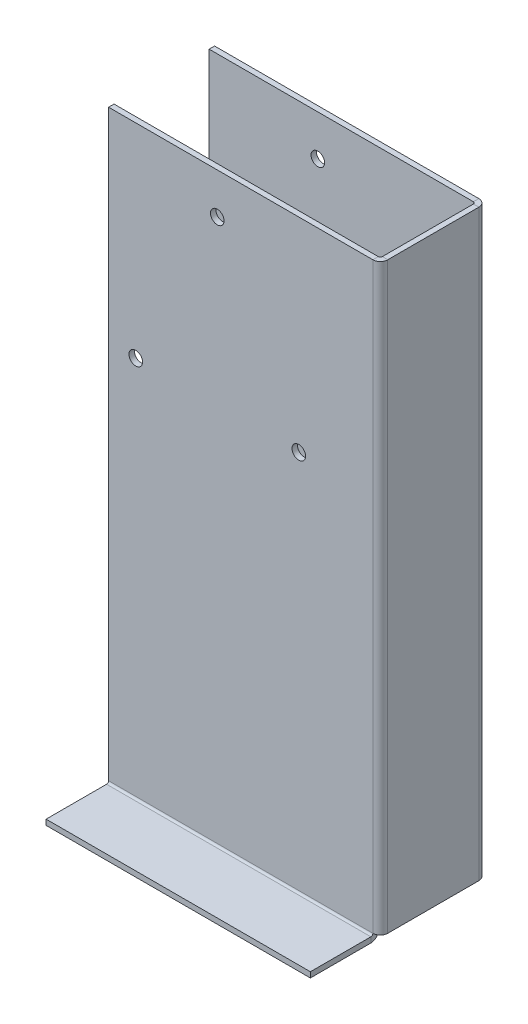
ISO-10303-21;
HEADER;
FILE_DESCRIPTION(('STEP AP214'),'2;1');
FILE_NAME('part.step','',(''),(''),'','','');
FILE_SCHEMA(('AUTOMOTIVE_DESIGN { 1 0 10303 214 1 1 1 1 }'));
ENDSEC;
DATA;
#1=APPLICATION_CONTEXT('core data for automotive mechanical design processes');
#2=APPLICATION_PROTOCOL_DEFINITION('international standard','automotive_design',2000,#1);
#3=PRODUCT_CONTEXT('',#1,'mechanical');
#4=PRODUCT('Part','Part','',(#3));
#5=PRODUCT_RELATED_PRODUCT_CATEGORY('part','',(#4));
#6=PRODUCT_DEFINITION_FORMATION('','',#4);
#7=PRODUCT_DEFINITION_CONTEXT('part definition',#1,'design');
#8=PRODUCT_DEFINITION('design','',#6,#7);
#9=PRODUCT_DEFINITION_SHAPE('','',#8);
#10=(LENGTH_UNIT() NAMED_UNIT(*) SI_UNIT(.MILLI.,.METRE.));
#11=(NAMED_UNIT(*) PLANE_ANGLE_UNIT() SI_UNIT($,.RADIAN.));
#12=(NAMED_UNIT(*) SI_UNIT($,.STERADIAN.) SOLID_ANGLE_UNIT());
#13=UNCERTAINTY_MEASURE_WITH_UNIT(LENGTH_MEASURE(1.E-05),#10,'distance_accuracy_value','');
#14=(GEOMETRIC_REPRESENTATION_CONTEXT(3) GLOBAL_UNCERTAINTY_ASSIGNED_CONTEXT((#13)) GLOBAL_UNIT_ASSIGNED_CONTEXT((#10,
#11,#12)) REPRESENTATION_CONTEXT('',''));
#15=CARTESIAN_POINT('',(0.,0.,0.));
#16=DIRECTION('',(0.,0.,1.));
#17=DIRECTION('',(1.,0.,0.));
#18=AXIS2_PLACEMENT_3D('',#15,#16,#17);
#19=CARTESIAN_POINT('',(1.52655665885959E-13,0.,-39.7366000000006));
#20=DIRECTION('',(-1.,0.,0.));
#21=DIRECTION('',(0.,-1.,0.));
#22=AXIS2_PLACEMENT_3D('',#19,#20,#21);
#23=CYLINDRICAL_SURFACE('',#22,2.73660000000001);
#24=DIRECTION('',(-1.,0.,0.));
#25=VECTOR('',#24,1.);
#26=CARTESIAN_POINT('',(97.2634000000002,-2.7366,-39.7366));
#27=LINE('',#26,#25);
#28=CARTESIAN_POINT('',(27.0000000000001,-2.73660000000008,-39.7366000000002));
#29=VERTEX_POINT('',#28);
#30=CARTESIAN_POINT('',(68.2634000000001,-2.73660000000008,-39.7366));
#31=VERTEX_POINT('',#30);
#32=EDGE_CURVE('E470',#29,#31,#27,.F.);
#33=ORIENTED_EDGE('',*,*,#32,.T.);
#34=CARTESIAN_POINT('',(68.2634000000001,0.,-39.7366000000003));
#35=DIRECTION('',(-1.,0.,0.));
#36=DIRECTION('',(0.,0.,1.));
#37=AXIS2_PLACEMENT_3D('',#34,#35,#36);
#38=CIRCLE('',#37,2.73660000000001);
#39=CARTESIAN_POINT('',(68.2634000000001,0.,-37.0000000000003));
#40=VERTEX_POINT('',#39);
#41=EDGE_CURVE('E424',#31,#40,#38,.T.);
#42=ORIENTED_EDGE('',*,*,#41,.T.);
#43=DIRECTION('',(1.,0.,0.));
#44=VECTOR('',#43,1.);
#45=CARTESIAN_POINT('',(1.18146875219874E-13,0.,-37.0000000000007));
#46=LINE('',#45,#44);
#47=CARTESIAN_POINT('',(27.0000000000001,0.,-37.0000000000006));
#48=VERTEX_POINT('',#47);
#49=EDGE_CURVE('E310',#40,#48,#46,.F.);
#50=ORIENTED_EDGE('',*,*,#49,.T.);
#51=CARTESIAN_POINT('',(27.0000000000001,0.,-39.7366000000005));
#52=DIRECTION('',(-1.,0.,0.));
#53=DIRECTION('',(0.,0.,1.));
#54=AXIS2_PLACEMENT_3D('',#51,#52,#53);
#55=CIRCLE('',#54,2.73660000000001);
#56=EDGE_CURVE('E438',#48,#29,#55,.F.);
#57=ORIENTED_EDGE('',*,*,#56,.T.);
#58=EDGE_LOOP('',(#33,#42,#50,#57));
#59=FACE_BOUND('',#58,.T.);
#60=ADVANCED_FACE('F119',(#59),#23,.T.);
#61=CARTESIAN_POINT('',(1.52655665885959E-13,0.,-39.7366000000006));
#62=DIRECTION('',(-1.,0.,0.));
#63=DIRECTION('',(0.,-1.,0.));
#64=AXIS2_PLACEMENT_3D('',#61,#62,#63);
#65=CYLINDRICAL_SURFACE('',#64,0.736600000000005);
#66=CARTESIAN_POINT('',(68.2634000000001,0.,-39.7366000000003));
#67=DIRECTION('',(1.,0.,0.));
#68=DIRECTION('',(0.,0.,-1.));
#69=AXIS2_PLACEMENT_3D('',#66,#67,#68);
#70=CIRCLE('',#69,0.736600000000005);
#71=CARTESIAN_POINT('',(68.2634000000001,-0.7366,-39.7366));
#72=VERTEX_POINT('',#71);
#73=CARTESIAN_POINT('',(68.2634000000001,0.,-39.0000000000003));
#74=VERTEX_POINT('',#73);
#75=EDGE_CURVE('E423',#72,#74,#70,.F.);
#76=ORIENTED_EDGE('',*,*,#75,.F.);
#77=DIRECTION('',(-1.,0.,0.));
#78=VECTOR('',#77,1.);
#79=CARTESIAN_POINT('',(97.2634000000002,-0.7366,-39.7366));
#80=LINE('',#79,#78);
#81=CARTESIAN_POINT('',(27.0000000000001,-0.736599999999999,-39.7366000000002));
#82=VERTEX_POINT('',#81);
#83=EDGE_CURVE('E461',#72,#82,#80,.T.);
#84=ORIENTED_EDGE('',*,*,#83,.T.);
#85=CARTESIAN_POINT('',(27.0000000000001,0.,-39.7366000000005));
#86=DIRECTION('',(-1.,0.,0.));
#87=DIRECTION('',(0.,0.,1.));
#88=AXIS2_PLACEMENT_3D('',#85,#86,#87);
#89=CIRCLE('',#88,0.736600000000005);
#90=CARTESIAN_POINT('',(27.0000000000001,0.,-39.0000000000004));
#91=VERTEX_POINT('',#90);
#92=EDGE_CURVE('E441',#91,#82,#89,.F.);
#93=ORIENTED_EDGE('',*,*,#92,.F.);
#94=DIRECTION('',(-1.,0.,0.));
#95=VECTOR('',#94,1.);
#96=CARTESIAN_POINT('',(2.74838428376477E-13,0.,-39.0000000000007));
#97=LINE('',#96,#95);
#98=EDGE_CURVE('E521',#74,#91,#97,.T.);
#99=ORIENTED_EDGE('',*,*,#98,.F.);
#100=EDGE_LOOP('',(#76,#84,#93,#99));
#101=FACE_BOUND('',#100,.T.);
#102=ADVANCED_FACE('F538',(#101),#65,.F.);
#103=CARTESIAN_POINT('',(0.,-2.73659999999986,0.));
#104=DIRECTION('',(0.,1.,0.));
#105=DIRECTION('',(0.,0.,1.));
#106=AXIS2_PLACEMENT_3D('',#103,#104,#105);
#107=PLANE('',#106);
#108=DIRECTION('',(0.,0.,-1.));
#109=VECTOR('',#108,1.);
#110=CARTESIAN_POINT('',(68.2634000000001,-2.73660000000008,-7.87116583932693));
#111=LINE('',#110,#109);
#112=CARTESIAN_POINT('',(68.2634000000001,-2.73660000000008,-62.0000000000002));
#113=VERTEX_POINT('',#112);
#114=EDGE_CURVE('E430',#31,#113,#111,.T.);
#115=ORIENTED_EDGE('',*,*,#114,.F.);
#116=ORIENTED_EDGE('',*,*,#32,.F.);
#117=DIRECTION('',(0.,0.,-1.));
#118=VECTOR('',#117,1.);
#119=CARTESIAN_POINT('',(27.0000000000001,-2.73660000000008,-7.87116583932693));
#120=LINE('',#119,#118);
#121=CARTESIAN_POINT('',(27.0000000000001,-2.73660000000008,-62.0000000000005));
#122=VERTEX_POINT('',#121);
#123=EDGE_CURVE('E454',#29,#122,#120,.T.);
#124=ORIENTED_EDGE('',*,*,#123,.T.);
#125=DIRECTION('',(1.,0.,0.));
#126=VECTOR('',#125,1.);
#127=CARTESIAN_POINT('',(4.24569898094263E-13,-2.73660000000008,-62.0000000000007));
#128=LINE('',#127,#126);
#129=EDGE_CURVE('E463',#122,#113,#128,.T.);
#130=ORIENTED_EDGE('',*,*,#129,.T.);
#131=EDGE_LOOP('',(#115,#116,#124,#130));
#132=FACE_BOUND('',#131,.T.);
#133=ADVANCED_FACE('F552',(#132),#107,.F.);
#134=CARTESIAN_POINT('',(0.,-0.736599999999859,0.));
#135=DIRECTION('',(0.,1.,0.));
#136=DIRECTION('',(0.,0.,1.));
#137=AXIS2_PLACEMENT_3D('',#134,#135,#136);
#138=PLANE('',#137);
#139=ORIENTED_EDGE('',*,*,#83,.F.);
#140=DIRECTION('',(0.,0.,1.));
#141=VECTOR('',#140,1.);
#142=CARTESIAN_POINT('',(68.2634000000001,-0.736599999999861,0.));
#143=LINE('',#142,#141);
#144=CARTESIAN_POINT('',(68.2634000000001,-0.736600000000077,-62.0000000000002));
#145=VERTEX_POINT('',#144);
#146=EDGE_CURVE('E431',#72,#145,#143,.F.);
#147=ORIENTED_EDGE('',*,*,#146,.T.);
#148=DIRECTION('',(-1.,0.,0.));
#149=VECTOR('',#148,1.);
#150=CARTESIAN_POINT('',(97.2634000000003,-0.736600000000078,-62.));
#151=LINE('',#150,#149);
#152=CARTESIAN_POINT('',(27.0000000000001,-0.736600000000076,-62.0000000000005));
#153=VERTEX_POINT('',#152);
#154=EDGE_CURVE('E467',#153,#145,#151,.F.);
#155=ORIENTED_EDGE('',*,*,#154,.F.);
#156=DIRECTION('',(0.,0.,1.));
#157=VECTOR('',#156,1.);
#158=CARTESIAN_POINT('',(27.0000000000001,-0.73659999999986,0.));
#159=LINE('',#158,#157);
#160=EDGE_CURVE('E136',#82,#153,#159,.F.);
#161=ORIENTED_EDGE('',*,*,#160,.F.);
#162=EDGE_LOOP('',(#139,#147,#155,#161));
#163=FACE_BOUND('',#162,.T.);
#164=ADVANCED_FACE('F541',(#163),#138,.T.);
#165=CARTESIAN_POINT('',(97.2634000000003,-2.73660000000008,-62.));
#166=DIRECTION('',(0.,0.,1.));
#167=DIRECTION('',(1.,0.,0.));
#168=AXIS2_PLACEMENT_3D('',#165,#166,#167);
#169=PLANE('',#168);
#170=DIRECTION('',(0.,-1.,0.));
#171=VECTOR('',#170,1.);
#172=CARTESIAN_POINT('',(68.2634000000001,-2.73660000000008,-62.0000000000002));
#173=LINE('',#172,#171);
#174=EDGE_CURVE('E436',#113,#145,#173,.F.);
#175=ORIENTED_EDGE('',*,*,#174,.F.);
#176=ORIENTED_EDGE('',*,*,#129,.F.);
#177=DIRECTION('',(0.,-1.,0.));
#178=VECTOR('',#177,1.);
#179=CARTESIAN_POINT('',(27.0000000000001,-2.73660000000008,-62.0000000000005));
#180=LINE('',#179,#178);
#181=EDGE_CURVE('E456',#122,#153,#180,.F.);
#182=ORIENTED_EDGE('',*,*,#181,.T.);
#183=ORIENTED_EDGE('',*,*,#154,.T.);
#184=EDGE_LOOP('',(#175,#176,#182,#183));
#185=FACE_BOUND('',#184,.T.);
#186=ADVANCED_FACE('F545',(#185),#169,.F.);
#187=CARTESIAN_POINT('',(100.,0.,-1.99999999999999));
#188=DIRECTION('',(0.,-1.,0.));
#189=DIRECTION('',(0.,0.,-1.));
#190=AXIS2_PLACEMENT_3D('',#187,#188,#189);
#191=PLANE('',#190);
#192=DIRECTION('',(0.,0.,-1.));
#193=VECTOR('',#192,1.);
#194=CARTESIAN_POINT('',(98.,0.,3.37567811541433E-13));
#195=LINE('',#194,#193);
#196=CARTESIAN_POINT('',(98.0000000000001,0.,-36.2634));
#197=VERTEX_POINT('',#196);
#198=CARTESIAN_POINT('',(98.,0.,-2.73660000000001));
#199=VERTEX_POINT('',#198);
#200=EDGE_CURVE('E341',#197,#199,#195,.F.);
#201=ORIENTED_EDGE('',*,*,#200,.F.);
#202=DIRECTION('',(1.,0.,0.));
#203=VECTOR('',#202,1.);
#204=CARTESIAN_POINT('',(98.0000000000001,0.,-36.2634));
#205=LINE('',#204,#203);
#206=CARTESIAN_POINT('',(100.,0.,-36.2634));
#207=VERTEX_POINT('',#206);
#208=EDGE_CURVE('E303',#197,#207,#205,.T.);
#209=ORIENTED_EDGE('',*,*,#208,.T.);
#210=DIRECTION('',(0.,0.,1.));
#211=VECTOR('',#210,1.);
#212=CARTESIAN_POINT('',(100.,0.,-1.99999999999999));
#213=LINE('',#212,#211);
#214=CARTESIAN_POINT('',(100.,0.,-2.7366));
#215=VERTEX_POINT('',#214);
#216=EDGE_CURVE('E335',#207,#215,#213,.T.);
#217=ORIENTED_EDGE('',*,*,#216,.T.);
#218=DIRECTION('',(1.,0.,0.));
#219=VECTOR('',#218,1.);
#220=CARTESIAN_POINT('',(98.,0.,-2.73660000000001));
#221=LINE('',#220,#219);
#222=EDGE_CURVE('E349',#199,#215,#221,.T.);
#223=ORIENTED_EDGE('',*,*,#222,.F.);
#224=EDGE_LOOP('',(#201,#209,#217,#223));
#225=FACE_BOUND('',#224,.T.);
#226=ADVANCED_FACE('F644',(#225),#191,.T.);
#227=CARTESIAN_POINT('',(100.,0.,3.44550774219119E-13));
#228=DIRECTION('',(1.,0.,0.));
#229=DIRECTION('',(0.,0.,-1.));
#230=AXIS2_PLACEMENT_3D('',#227,#228,#229);
#231=PLANE('',#230);
#232=ORIENTED_EDGE('',*,*,#216,.F.);
#233=DIRECTION('',(0.,-1.,0.));
#234=VECTOR('',#233,1.);
#235=CARTESIAN_POINT('',(100.,0.,-36.2634));
#236=LINE('',#235,#234);
#237=CARTESIAN_POINT('',(100.,214.69,-36.2634));
#238=VERTEX_POINT('',#237);
#239=EDGE_CURVE('E323',#207,#238,#236,.F.);
#240=ORIENTED_EDGE('',*,*,#239,.T.);
#241=DIRECTION('',(0.,0.,-1.));
#242=VECTOR('',#241,1.);
#243=CARTESIAN_POINT('',(100.,214.69,-39.));
#244=LINE('',#243,#242);
#245=CARTESIAN_POINT('',(100.,214.69,-2.7366));
#246=VERTEX_POINT('',#245);
#247=EDGE_CURVE('E338',#246,#238,#244,.T.);
#248=ORIENTED_EDGE('',*,*,#247,.F.);
#249=DIRECTION('',(0.,-1.,0.));
#250=VECTOR('',#249,1.);
#251=CARTESIAN_POINT('',(100.,0.,-2.7366));
#252=LINE('',#251,#250);
#253=EDGE_CURVE('E346',#246,#215,#252,.T.);
#254=ORIENTED_EDGE('',*,*,#253,.T.);
#255=EDGE_LOOP('',(#232,#240,#248,#254));
#256=FACE_BOUND('',#255,.T.);
#257=ADVANCED_FACE('F640',(#256),#231,.T.);
#258=CARTESIAN_POINT('',(98.,0.,3.37567811541433E-13));
#259=DIRECTION('',(1.,0.,0.));
#260=DIRECTION('',(0.,0.,-1.));
#261=AXIS2_PLACEMENT_3D('',#258,#259,#260);
#262=PLANE('',#261);
#263=DIRECTION('',(0.,-1.,0.));
#264=VECTOR('',#263,1.);
#265=CARTESIAN_POINT('',(98.0000000000001,0.,-36.2634));
#266=LINE('',#265,#264);
#267=CARTESIAN_POINT('',(98.0000000000001,214.69,-36.2634));
#268=VERTEX_POINT('',#267);
#269=EDGE_CURVE('E304',#197,#268,#266,.F.);
#270=ORIENTED_EDGE('',*,*,#269,.F.);
#271=ORIENTED_EDGE('',*,*,#200,.T.);
#272=DIRECTION('',(0.,1.,0.));
#273=VECTOR('',#272,1.);
#274=CARTESIAN_POINT('',(98.,214.69,-2.73660000000001));
#275=LINE('',#274,#273);
#276=CARTESIAN_POINT('',(98.,214.69,-2.73660000000001));
#277=VERTEX_POINT('',#276);
#278=EDGE_CURVE('E352',#277,#199,#275,.F.);
#279=ORIENTED_EDGE('',*,*,#278,.F.);
#280=DIRECTION('',(0.,0.,1.));
#281=VECTOR('',#280,1.);
#282=CARTESIAN_POINT('',(98.,214.69,3.37567811541433E-13));
#283=LINE('',#282,#281);
#284=EDGE_CURVE('E343',#277,#268,#283,.F.);
#285=ORIENTED_EDGE('',*,*,#284,.T.);
#286=EDGE_LOOP('',(#270,#271,#279,#285));
#287=FACE_BOUND('',#286,.T.);
#288=ADVANCED_FACE('F643',(#287),#262,.F.);
#289=CARTESIAN_POINT('',(0.,0.,-2.));
#290=DIRECTION('',(0.,0.,-1.));
#291=DIRECTION('',(-1.,0.,0.));
#292=AXIS2_PLACEMENT_3D('',#289,#290,#291);
#293=PLANE('',#292);
#294=CARTESIAN_POINT('',(70.,139.69,-2.));
#295=DIRECTION('',(0.,0.,-1.));
#296=DIRECTION('',(-1.,0.,0.));
#297=AXIS2_PLACEMENT_3D('',#294,#295,#296);
#298=CIRCLE('',#297,2.50000000000001);
#299=CARTESIAN_POINT('',(67.5,139.69,-2.));
#300=VERTEX_POINT('',#299);
#301=EDGE_CURVE('E413',#300,#300,#298,.T.);
#302=ORIENTED_EDGE('',*,*,#301,.F.);
#303=EDGE_LOOP('',(#302));
#304=FACE_BOUND('',#303,.T.);
#305=CARTESIAN_POINT('',(10.,139.69,-2.));
#306=DIRECTION('',(0.,0.,-1.));
#307=DIRECTION('',(-1.,0.,0.));
#308=AXIS2_PLACEMENT_3D('',#305,#306,#307);
#309=CIRCLE('',#308,2.50000000000003);
#310=CARTESIAN_POINT('',(7.49999999999997,139.69,-2.));
#311=VERTEX_POINT('',#310);
#312=EDGE_CURVE('E400',#311,#311,#309,.T.);
#313=ORIENTED_EDGE('',*,*,#312,.F.);
#314=EDGE_LOOP('',(#313));
#315=FACE_BOUND('',#314,.T.);
#316=CARTESIAN_POINT('',(40.,199.69,-2.));
#317=DIRECTION('',(0.,0.,-1.));
#318=DIRECTION('',(-1.,0.,0.));
#319=AXIS2_PLACEMENT_3D('',#316,#317,#318);
#320=CIRCLE('',#319,2.50000000000004);
#321=CARTESIAN_POINT('',(37.5,199.69,-2.));
#322=VERTEX_POINT('',#321);
#323=EDGE_CURVE('E396',#322,#322,#320,.T.);
#324=ORIENTED_EDGE('',*,*,#323,.F.);
#325=EDGE_LOOP('',(#324));
#326=FACE_BOUND('',#325,.T.);
#327=DIRECTION('',(-1.,0.,0.));
#328=VECTOR('',#327,1.);
#329=CARTESIAN_POINT('',(0.,214.69,-2.));
#330=LINE('',#329,#328);
#331=CARTESIAN_POINT('',(97.2634,214.69,-2.));
#332=VERTEX_POINT('',#331);
#333=CARTESIAN_POINT('',(0.,214.69,-2.));
#334=VERTEX_POINT('',#333);
#335=EDGE_CURVE('E386',#332,#334,#330,.T.);
#336=ORIENTED_EDGE('',*,*,#335,.F.);
#337=DIRECTION('',(0.,-1.,0.));
#338=VECTOR('',#337,1.);
#339=CARTESIAN_POINT('',(97.2634,0.,-2.));
#340=LINE('',#339,#338);
#341=CARTESIAN_POINT('',(97.2634,0.,-2.));
#342=VERTEX_POINT('',#341);
#343=EDGE_CURVE('E369',#342,#332,#340,.F.);
#344=ORIENTED_EDGE('',*,*,#343,.F.);
#345=DIRECTION('',(1.,0.,0.));
#346=VECTOR('',#345,1.);
#347=CARTESIAN_POINT('',(0.,0.,-2.));
#348=LINE('',#347,#346);
#349=CARTESIAN_POINT('',(0.,0.,-2.));
#350=VERTEX_POINT('',#349);
#351=EDGE_CURVE('E382',#350,#342,#348,.T.);
#352=ORIENTED_EDGE('',*,*,#351,.F.);
#353=DIRECTION('',(0.,-1.,0.));
#354=VECTOR('',#353,1.);
#355=CARTESIAN_POINT('',(0.,0.,-2.));
#356=LINE('',#355,#354);
#357=EDGE_CURVE('E379',#334,#350,#356,.T.);
#358=ORIENTED_EDGE('',*,*,#357,.F.);
#359=EDGE_LOOP('',(#336,#344,#352,#358));
#360=FACE_BOUND('',#359,.T.);
#361=ADVANCED_FACE('F648',(#304,#315,#326,#360),#293,.T.);
#362=CARTESIAN_POINT('',(0.,0.,0.));
#363=DIRECTION('',(0.,0.,-1.));
#364=DIRECTION('',(-1.,0.,0.));
#365=AXIS2_PLACEMENT_3D('',#362,#363,#364);
#366=PLANE('',#365);
#367=CARTESIAN_POINT('',(70.,139.69,0.));
#368=DIRECTION('',(0.,0.,1.));
#369=DIRECTION('',(1.,0.,0.));
#370=AXIS2_PLACEMENT_3D('',#367,#368,#369);
#371=CIRCLE('',#370,2.50000000000001);
#372=CARTESIAN_POINT('',(72.5,139.69,0.));
#373=VERTEX_POINT('',#372);
#374=EDGE_CURVE('E1119',#373,#373,#371,.T.);
#375=ORIENTED_EDGE('',*,*,#374,.F.);
#376=EDGE_LOOP('',(#375));
#377=FACE_BOUND('',#376,.T.);
#378=CARTESIAN_POINT('',(10.,139.69,0.));
#379=DIRECTION('',(0.,0.,1.));
#380=DIRECTION('',(1.,0.,0.));
#381=AXIS2_PLACEMENT_3D('',#378,#379,#380);
#382=CIRCLE('',#381,2.50000000000003);
#383=CARTESIAN_POINT('',(12.5,139.69,0.));
#384=VERTEX_POINT('',#383);
#385=EDGE_CURVE('E408',#384,#384,#382,.T.);
#386=ORIENTED_EDGE('',*,*,#385,.F.);
#387=EDGE_LOOP('',(#386));
#388=FACE_BOUND('',#387,.T.);
#389=CARTESIAN_POINT('',(40.,199.69,0.));
#390=DIRECTION('',(0.,0.,1.));
#391=DIRECTION('',(1.,0.,0.));
#392=AXIS2_PLACEMENT_3D('',#389,#390,#391);
#393=CIRCLE('',#392,2.50000000000004);
#394=CARTESIAN_POINT('',(42.5,199.69,0.));
#395=VERTEX_POINT('',#394);
#396=EDGE_CURVE('E405',#395,#395,#393,.T.);
#397=ORIENTED_EDGE('',*,*,#396,.F.);
#398=EDGE_LOOP('',(#397));
#399=FACE_BOUND('',#398,.T.);
#400=DIRECTION('',(0.,-1.,0.));
#401=VECTOR('',#400,1.);
#402=CARTESIAN_POINT('',(97.2634,0.,0.));
#403=LINE('',#402,#401);
#404=CARTESIAN_POINT('',(97.2634,0.,0.));
#405=VERTEX_POINT('',#404);
#406=CARTESIAN_POINT('',(97.2634,214.69,0.));
#407=VERTEX_POINT('',#406);
#408=EDGE_CURVE('E357',#405,#407,#403,.F.);
#409=ORIENTED_EDGE('',*,*,#408,.T.);
#410=DIRECTION('',(-1.,0.,0.));
#411=VECTOR('',#410,1.);
#412=CARTESIAN_POINT('',(0.,214.69,0.));
#413=LINE('',#412,#411);
#414=CARTESIAN_POINT('',(0.,214.69,0.));
#415=VERTEX_POINT('',#414);
#416=EDGE_CURVE('E383',#407,#415,#413,.T.);
#417=ORIENTED_EDGE('',*,*,#416,.T.);
#418=DIRECTION('',(0.,-1.,0.));
#419=VECTOR('',#418,1.);
#420=CARTESIAN_POINT('',(0.,0.,0.));
#421=LINE('',#420,#419);
#422=CARTESIAN_POINT('',(0.,0.,0.));
#423=VERTEX_POINT('',#422);
#424=EDGE_CURVE('E376',#415,#423,#421,.T.);
#425=ORIENTED_EDGE('',*,*,#424,.T.);
#426=DIRECTION('',(1.,0.,0.));
#427=VECTOR('',#426,1.);
#428=CARTESIAN_POINT('',(0.,0.,0.));
#429=LINE('',#428,#427);
#430=EDGE_CURVE('E390',#423,#405,#429,.T.);
#431=ORIENTED_EDGE('',*,*,#430,.T.);
#432=EDGE_LOOP('',(#409,#417,#425,#431));
#433=FACE_BOUND('',#432,.T.);
#434=ADVANCED_FACE('F675',(#377,#388,#399,#433),#366,.F.);
#435=CARTESIAN_POINT('',(0.,0.,-2.));
#436=DIRECTION('',(-1.,0.,0.));
#437=DIRECTION('',(0.,0.,1.));
#438=AXIS2_PLACEMENT_3D('',#435,#436,#437);
#439=PLANE('',#438);
#440=ORIENTED_EDGE('',*,*,#424,.F.);
#441=DIRECTION('',(0.,0.,1.));
#442=VECTOR('',#441,1.);
#443=CARTESIAN_POINT('',(0.,214.69,-2.));
#444=LINE('',#443,#442);
#445=EDGE_CURVE('E13',#334,#415,#444,.T.);
#446=ORIENTED_EDGE('',*,*,#445,.F.);
#447=ORIENTED_EDGE('',*,*,#357,.T.);
#448=DIRECTION('',(0.,0.,1.));
#449=VECTOR('',#448,1.);
#450=CARTESIAN_POINT('',(0.,0.,-2.));
#451=LINE('',#450,#449);
#452=EDGE_CURVE('E128',#350,#423,#451,.T.);
#453=ORIENTED_EDGE('',*,*,#452,.T.);
#454=EDGE_LOOP('',(#440,#446,#447,#453));
#455=FACE_BOUND('',#454,.T.);
#456=ADVANCED_FACE('F121',(#455),#439,.T.);
#457=CARTESIAN_POINT('',(0.,214.69,-2.));
#458=DIRECTION('',(0.,1.,0.));
#459=DIRECTION('',(0.,0.,1.));
#460=AXIS2_PLACEMENT_3D('',#457,#458,#459);
#461=PLANE('',#460);
#462=DIRECTION('',(0.,0.,1.));
#463=VECTOR('',#462,1.);
#464=CARTESIAN_POINT('',(97.2634,214.69,-2.));
#465=LINE('',#464,#463);
#466=EDGE_CURVE('E373',#332,#407,#465,.T.);
#467=ORIENTED_EDGE('',*,*,#466,.F.);
#468=ORIENTED_EDGE('',*,*,#335,.T.);
#469=ORIENTED_EDGE('',*,*,#445,.T.);
#470=ORIENTED_EDGE('',*,*,#416,.F.);
#471=EDGE_LOOP('',(#467,#468,#469,#470));
#472=FACE_BOUND('',#471,.T.);
#473=ADVANCED_FACE('F668',(#472),#461,.T.);
#474=CARTESIAN_POINT('',(97.2634,214.69,-2.73660000000001));
#475=DIRECTION('',(0.,1.,0.));
#476=DIRECTION('',(0.,0.,1.));
#477=AXIS2_PLACEMENT_3D('',#474,#475,#476);
#478=PLANE('',#477);
#479=DIRECTION('',(1.,0.,0.));
#480=VECTOR('',#479,1.);
#481=CARTESIAN_POINT('',(100.,214.69,-2.7366));
#482=LINE('',#481,#480);
#483=EDGE_CURVE('E333',#277,#246,#482,.T.);
#484=ORIENTED_EDGE('',*,*,#483,.F.);
#485=CARTESIAN_POINT('',(97.2634,214.69,-2.73660000000001));
#486=DIRECTION('',(0.,-1.,0.));
#487=DIRECTION('',(0.,0.,-1.));
#488=AXIS2_PLACEMENT_3D('',#485,#486,#487);
#489=CIRCLE('',#488,0.736600000000004);
#490=EDGE_CURVE('E366',#332,#277,#489,.F.);
#491=ORIENTED_EDGE('',*,*,#490,.F.);
#492=ORIENTED_EDGE('',*,*,#466,.T.);
#493=CARTESIAN_POINT('',(97.2634,214.69,-2.73660000000001));
#494=DIRECTION('',(0.,-1.,0.));
#495=DIRECTION('',(0.,0.,-1.));
#496=AXIS2_PLACEMENT_3D('',#493,#494,#495);
#497=CIRCLE('',#496,2.7366);
#498=EDGE_CURVE('E359',#407,#246,#497,.F.);
#499=ORIENTED_EDGE('',*,*,#498,.T.);
#500=EDGE_LOOP('',(#484,#491,#492,#499));
#501=FACE_BOUND('',#500,.T.);
#502=ADVANCED_FACE('F665',(#501),#478,.T.);
#503=CARTESIAN_POINT('',(97.2634,0.,-2.73660000000001));
#504=DIRECTION('',(0.,1.,0.));
#505=DIRECTION('',(0.,0.,1.));
#506=AXIS2_PLACEMENT_3D('',#503,#504,#505);
#507=PLANE('',#506);
#508=CARTESIAN_POINT('',(97.2634,0.,-2.73660000000001));
#509=DIRECTION('',(0.,-1.,0.));
#510=DIRECTION('',(0.,0.,-1.));
#511=AXIS2_PLACEMENT_3D('',#508,#509,#510);
#512=CIRCLE('',#511,0.736600000000004);
#513=EDGE_CURVE('E337',#199,#342,#512,.T.);
#514=ORIENTED_EDGE('',*,*,#513,.F.);
#515=ORIENTED_EDGE('',*,*,#222,.T.);
#516=CARTESIAN_POINT('',(97.2634,0.,-2.73660000000001));
#517=DIRECTION('',(0.,-1.,0.));
#518=DIRECTION('',(0.,0.,-1.));
#519=AXIS2_PLACEMENT_3D('',#516,#517,#518);
#520=CIRCLE('',#519,2.7366);
#521=EDGE_CURVE('E360',#215,#405,#520,.T.);
#522=ORIENTED_EDGE('',*,*,#521,.T.);
#523=DIRECTION('',(0.,0.,1.));
#524=VECTOR('',#523,1.);
#525=CARTESIAN_POINT('',(97.2634,0.,-2.));
#526=LINE('',#525,#524);
#527=EDGE_CURVE('E363',#342,#405,#526,.T.);
#528=ORIENTED_EDGE('',*,*,#527,.F.);
#529=EDGE_LOOP('',(#514,#515,#522,#528));
#530=FACE_BOUND('',#529,.T.);
#531=ADVANCED_FACE('F660',(#530),#507,.F.);
#532=CARTESIAN_POINT('',(97.2634,0.,-2.73660000000001));
#533=DIRECTION('',(0.,-1.,0.));
#534=DIRECTION('',(1.,0.,0.));
#535=AXIS2_PLACEMENT_3D('',#532,#533,#534);
#536=CYLINDRICAL_SURFACE('',#535,2.7366);
#537=ORIENTED_EDGE('',*,*,#408,.F.);
#538=ORIENTED_EDGE('',*,*,#521,.F.);
#539=ORIENTED_EDGE('',*,*,#253,.F.);
#540=ORIENTED_EDGE('',*,*,#498,.F.);
#541=EDGE_LOOP('',(#537,#538,#539,#540));
#542=FACE_BOUND('',#541,.T.);
#543=ADVANCED_FACE('F657',(#542),#536,.T.);
#544=CARTESIAN_POINT('',(97.2634,0.,-2.73660000000001));
#545=DIRECTION('',(0.,-1.,0.));
#546=DIRECTION('',(1.,0.,0.));
#547=AXIS2_PLACEMENT_3D('',#544,#545,#546);
#548=CYLINDRICAL_SURFACE('',#547,0.736600000000004);
#549=ORIENTED_EDGE('',*,*,#343,.T.);
#550=ORIENTED_EDGE('',*,*,#490,.T.);
#551=ORIENTED_EDGE('',*,*,#278,.T.);
#552=ORIENTED_EDGE('',*,*,#513,.T.);
#553=EDGE_LOOP('',(#549,#550,#551,#552));
#554=FACE_BOUND('',#553,.T.);
#555=ADVANCED_FACE('F655',(#554),#548,.F.);
#556=CARTESIAN_POINT('',(100.,214.69,-39.));
#557=DIRECTION('',(0.,1.,0.));
#558=DIRECTION('',(0.,0.,1.));
#559=AXIS2_PLACEMENT_3D('',#556,#557,#558);
#560=PLANE('',#559);
#561=DIRECTION('',(1.,0.,0.));
#562=VECTOR('',#561,1.);
#563=CARTESIAN_POINT('',(98.0000000000001,214.69,-36.2634));
#564=LINE('',#563,#562);
#565=EDGE_CURVE('E331',#268,#238,#564,.T.);
#566=ORIENTED_EDGE('',*,*,#565,.F.);
#567=ORIENTED_EDGE('',*,*,#284,.F.);
#568=ORIENTED_EDGE('',*,*,#483,.T.);
#569=ORIENTED_EDGE('',*,*,#247,.T.);
#570=EDGE_LOOP('',(#566,#567,#568,#569));
#571=FACE_BOUND('',#570,.T.);
#572=ADVANCED_FACE('F636',(#571),#560,.T.);
#573=CARTESIAN_POINT('',(97.2634000000001,214.69,-36.2634));
#574=DIRECTION('',(0.,1.,0.));
#575=DIRECTION('',(0.,0.,1.));
#576=AXIS2_PLACEMENT_3D('',#573,#574,#575);
#577=PLANE('',#576);
#578=DIRECTION('',(0.,0.,1.));
#579=VECTOR('',#578,1.);
#580=CARTESIAN_POINT('',(97.2634000000001,214.69,-39.));
#581=LINE('',#580,#579);
#582=CARTESIAN_POINT('',(97.2634000000001,214.69,-37.));
#583=VERTEX_POINT('',#582);
#584=CARTESIAN_POINT('',(97.2634000000001,214.69,-39.));
#585=VERTEX_POINT('',#584);
#586=EDGE_CURVE('E299',#583,#585,#581,.F.);
#587=ORIENTED_EDGE('',*,*,#586,.F.);
#588=CARTESIAN_POINT('',(97.2634000000001,214.69,-36.2634));
#589=DIRECTION('',(0.,-1.,0.));
#590=DIRECTION('',(0.,0.,-1.));
#591=AXIS2_PLACEMENT_3D('',#588,#589,#590);
#592=CIRCLE('',#591,0.736599999999997);
#593=EDGE_CURVE('E295',#268,#583,#592,.F.);
#594=ORIENTED_EDGE('',*,*,#593,.F.);
#595=ORIENTED_EDGE('',*,*,#565,.T.);
#596=CARTESIAN_POINT('',(97.2634000000001,214.69,-36.2634));
#597=DIRECTION('',(0.,-1.,0.));
#598=DIRECTION('',(0.,0.,-1.));
#599=AXIS2_PLACEMENT_3D('',#596,#597,#598);
#600=CIRCLE('',#599,2.7366);
#601=EDGE_CURVE('E144',#238,#585,#600,.F.);
#602=ORIENTED_EDGE('',*,*,#601,.T.);
#603=EDGE_LOOP('',(#587,#594,#595,#602));
#604=FACE_BOUND('',#603,.T.);
#605=ADVANCED_FACE('F633',(#604),#577,.T.);
#606=CARTESIAN_POINT('',(97.2634000000001,0.,-36.2634));
#607=DIRECTION('',(0.,1.,0.));
#608=DIRECTION('',(0.,0.,1.));
#609=AXIS2_PLACEMENT_3D('',#606,#607,#608);
#610=PLANE('',#609);
#611=CARTESIAN_POINT('',(97.2634000000001,0.,-36.2634));
#612=DIRECTION('',(0.,-1.,0.));
#613=DIRECTION('',(0.,0.,-1.));
#614=AXIS2_PLACEMENT_3D('',#611,#612,#613);
#615=CIRCLE('',#614,0.736599999999997);
#616=CARTESIAN_POINT('',(97.2634000000001,0.,-37.0000000000001));
#617=VERTEX_POINT('',#616);
#618=EDGE_CURVE('E292',#617,#197,#615,.T.);
#619=ORIENTED_EDGE('',*,*,#618,.F.);
#620=DIRECTION('',(0.,0.,1.));
#621=VECTOR('',#620,1.);
#622=CARTESIAN_POINT('',(97.2634000000001,0.,-37.));
#623=LINE('',#622,#621);
#624=CARTESIAN_POINT('',(97.2634000000001,0.,-39.));
#625=VERTEX_POINT('',#624);
#626=EDGE_CURVE('E270',#617,#625,#623,.F.);
#627=ORIENTED_EDGE('',*,*,#626,.T.);
#628=CARTESIAN_POINT('',(97.2634000000001,0.,-36.2634));
#629=DIRECTION('',(0.,-1.,0.));
#630=DIRECTION('',(0.,0.,-1.));
#631=AXIS2_PLACEMENT_3D('',#628,#629,#630);
#632=CIRCLE('',#631,2.7366);
#633=EDGE_CURVE('E326',#625,#207,#632,.T.);
#634=ORIENTED_EDGE('',*,*,#633,.T.);
#635=ORIENTED_EDGE('',*,*,#208,.F.);
#636=EDGE_LOOP('',(#619,#627,#634,#635));
#637=FACE_BOUND('',#636,.T.);
#638=ADVANCED_FACE('F301',(#637),#610,.F.);
#639=CARTESIAN_POINT('',(97.2634000000001,0.,-36.2634));
#640=DIRECTION('',(0.,-1.,0.));
#641=DIRECTION('',(0.,0.,-1.));
#642=AXIS2_PLACEMENT_3D('',#639,#640,#641);
#643=CYLINDRICAL_SURFACE('',#642,2.7366);
#644=ORIENTED_EDGE('',*,*,#239,.F.);
#645=ORIENTED_EDGE('',*,*,#633,.F.);
#646=DIRECTION('',(0.,-1.,0.));
#647=VECTOR('',#646,1.);
#648=CARTESIAN_POINT('',(97.2634000000001,214.69,-39.));
#649=LINE('',#648,#647);
#650=EDGE_CURVE('E284',#625,#585,#649,.F.);
#651=ORIENTED_EDGE('',*,*,#650,.T.);
#652=ORIENTED_EDGE('',*,*,#601,.F.);
#653=EDGE_LOOP('',(#644,#645,#651,#652));
#654=FACE_BOUND('',#653,.T.);
#655=ADVANCED_FACE('F628',(#654),#643,.T.);
#656=CARTESIAN_POINT('',(97.2634000000001,0.,-36.2634));
#657=DIRECTION('',(0.,-1.,0.));
#658=DIRECTION('',(0.,0.,-1.));
#659=AXIS2_PLACEMENT_3D('',#656,#657,#658);
#660=CYLINDRICAL_SURFACE('',#659,0.736599999999997);
#661=ORIENTED_EDGE('',*,*,#269,.T.);
#662=ORIENTED_EDGE('',*,*,#593,.T.);
#663=DIRECTION('',(0.,-1.,0.));
#664=VECTOR('',#663,1.);
#665=CARTESIAN_POINT('',(97.2634000000001,214.69,-37.));
#666=LINE('',#665,#664);
#667=EDGE_CURVE('E285',#583,#617,#666,.T.);
#668=ORIENTED_EDGE('',*,*,#667,.T.);
#669=ORIENTED_EDGE('',*,*,#618,.T.);
#670=EDGE_LOOP('',(#661,#662,#668,#669));
#671=FACE_BOUND('',#670,.T.);
#672=ADVANCED_FACE('F291',(#671),#660,.F.);
#673=CARTESIAN_POINT('',(98.0000000000001,214.69,-39.));
#674=DIRECTION('',(0.,-1.,0.));
#675=DIRECTION('',(0.,0.,-1.));
#676=AXIS2_PLACEMENT_3D('',#673,#674,#675);
#677=PLANE('',#676);
#678=ORIENTED_EDGE('',*,*,#586,.T.);
#679=DIRECTION('',(1.,0.,0.));
#680=VECTOR('',#679,1.);
#681=CARTESIAN_POINT('',(2.74838428376477E-13,214.69,-39.0000000000007));
#682=LINE('',#681,#680);
#683=CARTESIAN_POINT('',(1.21452677705266E-13,214.69,-39.0000000000007));
#684=VERTEX_POINT('',#683);
#685=EDGE_CURVE('E313',#684,#585,#682,.T.);
#686=ORIENTED_EDGE('',*,*,#685,.F.);
#687=DIRECTION('',(0.,0.,1.));
#688=VECTOR('',#687,1.);
#689=CARTESIAN_POINT('',(1.2490009027033E-13,214.69,-39.0000000000007));
#690=LINE('',#689,#688);
#691=CARTESIAN_POINT('',(1.09370330629633E-13,214.69,-37.0000000000007));
#692=VERTEX_POINT('',#691);
#693=EDGE_CURVE('E516',#684,#692,#690,.T.);
#694=ORIENTED_EDGE('',*,*,#693,.T.);
#695=DIRECTION('',(-1.,0.,0.));
#696=VECTOR('',#695,1.);
#697=CARTESIAN_POINT('',(98.0000000000001,214.69,-37.));
#698=LINE('',#697,#696);
#699=EDGE_CURVE('E315',#692,#583,#698,.F.);
#700=ORIENTED_EDGE('',*,*,#699,.T.);
#701=EDGE_LOOP('',(#678,#686,#694,#700));
#702=FACE_BOUND('',#701,.T.);
#703=ADVANCED_FACE('F617',(#702),#677,.F.);
#704=CARTESIAN_POINT('',(2.74838428376477E-13,0.,-39.0000000000007));
#705=DIRECTION('',(0.,0.,1.));
#706=DIRECTION('',(1.,0.,0.));
#707=AXIS2_PLACEMENT_3D('',#704,#705,#706);
#708=PLANE('',#707);
#709=CARTESIAN_POINT('',(70.,139.69,-39.0000000000002));
#710=DIRECTION('',(0.,0.,1.));
#711=DIRECTION('',(1.,0.,0.));
#712=AXIS2_PLACEMENT_3D('',#709,#710,#711);
#713=CIRCLE('',#712,2.50000000000001);
#714=CARTESIAN_POINT('',(72.5,139.69,-39.0000000000002));
#715=VERTEX_POINT('',#714);
#716=EDGE_CURVE('E1120',#715,#715,#713,.F.);
#717=ORIENTED_EDGE('',*,*,#716,.F.);
#718=EDGE_LOOP('',(#717));
#719=FACE_BOUND('',#718,.T.);
#720=CARTESIAN_POINT('',(10.,139.69,-39.0000000000006));
#721=DIRECTION('',(0.,0.,1.));
#722=DIRECTION('',(1.,0.,0.));
#723=AXIS2_PLACEMENT_3D('',#720,#721,#722);
#724=CIRCLE('',#723,2.50000000000003);
#725=CARTESIAN_POINT('',(12.5,139.69,-39.0000000000006));
#726=VERTEX_POINT('',#725);
#727=EDGE_CURVE('E401',#726,#726,#724,.F.);
#728=ORIENTED_EDGE('',*,*,#727,.F.);
#729=EDGE_LOOP('',(#728));
#730=FACE_BOUND('',#729,.T.);
#731=CARTESIAN_POINT('',(40.,199.69,-39.0000000000004));
#732=DIRECTION('',(0.,0.,1.));
#733=DIRECTION('',(1.,0.,0.));
#734=AXIS2_PLACEMENT_3D('',#731,#732,#733);
#735=CIRCLE('',#734,2.50000000000004);
#736=CARTESIAN_POINT('',(42.5,199.69,-39.0000000000004));
#737=VERTEX_POINT('',#736);
#738=EDGE_CURVE('E397',#737,#737,#735,.F.);
#739=ORIENTED_EDGE('',*,*,#738,.F.);
#740=EDGE_LOOP('',(#739));
#741=FACE_BOUND('',#740,.T.);
#742=ORIENTED_EDGE('',*,*,#650,.F.);
#743=EDGE_CURVE('E278',#625,#74,#97,.T.);
#744=ORIENTED_EDGE('',*,*,#743,.T.);
#745=ORIENTED_EDGE('',*,*,#98,.T.);
#746=DIRECTION('',(-1.,0.,0.));
#747=VECTOR('',#746,1.);
#748=CARTESIAN_POINT('',(1.49186218934005E-13,0.,-39.0000000000006));
#749=LINE('',#748,#747);
#750=CARTESIAN_POINT('',(1.35843345973643E-13,0.,-39.0000000000006));
#751=VERTEX_POINT('',#750);
#752=EDGE_CURVE('E444',#91,#751,#749,.T.);
#753=ORIENTED_EDGE('',*,*,#752,.T.);
#754=DIRECTION('',(0.,1.,0.));
#755=VECTOR('',#754,1.);
#756=CARTESIAN_POINT('',(1.31883052948016E-13,0.,-39.0000000000007));
#757=LINE('',#756,#755);
#758=EDGE_CURVE('E519',#751,#684,#757,.T.);
#759=ORIENTED_EDGE('',*,*,#758,.T.);
#760=ORIENTED_EDGE('',*,*,#685,.T.);
#761=EDGE_LOOP('',(#742,#744,#745,#753,#759,#760));
#762=FACE_BOUND('',#761,.T.);
#763=ADVANCED_FACE('F527',(#719,#730,#741,#762),#708,.F.);
#764=CARTESIAN_POINT('',(2.61104109467962E-13,0.,-37.0000000000007));
#765=DIRECTION('',(0.,0.,1.));
#766=DIRECTION('',(1.,0.,0.));
#767=AXIS2_PLACEMENT_3D('',#764,#765,#766);
#768=PLANE('',#767);
#769=CARTESIAN_POINT('',(70.,139.69,-37.0000000000002));
#770=DIRECTION('',(0.,0.,1.));
#771=DIRECTION('',(1.,0.,0.));
#772=AXIS2_PLACEMENT_3D('',#769,#770,#771);
#773=CIRCLE('',#772,2.50000000000001);
#774=CARTESIAN_POINT('',(72.5,139.69,-37.0000000000002));
#775=VERTEX_POINT('',#774);
#776=EDGE_CURVE('E123',#775,#775,#773,.T.);
#777=ORIENTED_EDGE('',*,*,#776,.F.);
#778=EDGE_LOOP('',(#777));
#779=FACE_BOUND('',#778,.T.);
#780=CARTESIAN_POINT('',(10.,139.69,-37.0000000000006));
#781=DIRECTION('',(0.,0.,1.));
#782=DIRECTION('',(1.,0.,0.));
#783=AXIS2_PLACEMENT_3D('',#780,#781,#782);
#784=CIRCLE('',#783,2.50000000000003);
#785=CARTESIAN_POINT('',(12.5,139.69,-37.0000000000006));
#786=VERTEX_POINT('',#785);
#787=EDGE_CURVE('E398',#786,#786,#784,.T.);
#788=ORIENTED_EDGE('',*,*,#787,.F.);
#789=EDGE_LOOP('',(#788));
#790=FACE_BOUND('',#789,.T.);
#791=CARTESIAN_POINT('',(40.,199.69,-37.0000000000004));
#792=DIRECTION('',(0.,0.,1.));
#793=DIRECTION('',(1.,0.,0.));
#794=AXIS2_PLACEMENT_3D('',#791,#792,#793);
#795=CIRCLE('',#794,2.50000000000004);
#796=CARTESIAN_POINT('',(42.5,199.69,-37.0000000000004));
#797=VERTEX_POINT('',#796);
#798=EDGE_CURVE('E394',#797,#797,#795,.T.);
#799=ORIENTED_EDGE('',*,*,#798,.F.);
#800=EDGE_LOOP('',(#799));
#801=FACE_BOUND('',#800,.T.);
#802=EDGE_CURVE('E275',#617,#40,#46,.F.);
#803=ORIENTED_EDGE('',*,*,#802,.F.);
#804=ORIENTED_EDGE('',*,*,#667,.F.);
#805=ORIENTED_EDGE('',*,*,#699,.F.);
#806=DIRECTION('',(0.,-1.,0.));
#807=VECTOR('',#806,1.);
#808=CARTESIAN_POINT('',(1.04270946231687E-13,214.69,-37.0000000000007));
#809=LINE('',#808,#807);
#810=CARTESIAN_POINT('',(1.26423180478249E-13,0.,-37.0000000000006));
#811=VERTEX_POINT('',#810);
#812=EDGE_CURVE('E311',#811,#692,#809,.F.);
#813=ORIENTED_EDGE('',*,*,#812,.F.);
#814=DIRECTION('',(-1.,0.,0.));
#815=VECTOR('',#814,1.);
#816=CARTESIAN_POINT('',(3.39224461850834E-13,0.,-37.0000000000007));
#817=LINE('',#816,#815);
#818=EDGE_CURVE('E445',#48,#811,#817,.T.);
#819=ORIENTED_EDGE('',*,*,#818,.F.);
#820=ORIENTED_EDGE('',*,*,#49,.F.);
#821=EDGE_LOOP('',(#803,#804,#805,#813,#819,#820));
#822=FACE_BOUND('',#821,.T.);
#823=ADVANCED_FACE('F308',(#779,#790,#801,#822),#768,.T.);
#824=CARTESIAN_POINT('',(1.18005265140202E-13,214.69,-39.0000000000007));
#825=DIRECTION('',(1.,0.,0.));
#826=DIRECTION('',(0.,0.,-1.));
#827=AXIS2_PLACEMENT_3D('',#824,#825,#826);
#828=PLANE('',#827);
#829=ORIENTED_EDGE('',*,*,#812,.T.);
#830=ORIENTED_EDGE('',*,*,#693,.F.);
#831=ORIENTED_EDGE('',*,*,#758,.F.);
#832=DIRECTION('',(0.,0.,1.));
#833=VECTOR('',#832,1.);
#834=CARTESIAN_POINT('',(1.31883052948016E-13,0.,-39.0000000000007));
#835=LINE('',#834,#833);
#836=EDGE_CURVE('E305',#751,#811,#835,.T.);
#837=ORIENTED_EDGE('',*,*,#836,.T.);
#838=EDGE_LOOP('',(#829,#830,#831,#837));
#839=FACE_BOUND('',#838,.T.);
#840=ADVANCED_FACE('F610',(#839),#828,.F.);
#841=CARTESIAN_POINT('',(0.,0.,0.736600000000001));
#842=DIRECTION('',(-1.,0.,0.));
#843=DIRECTION('',(0.,0.,1.));
#844=AXIS2_PLACEMENT_3D('',#841,#842,#843);
#845=PLANE('',#844);
#846=DIRECTION('',(0.,1.,0.));
#847=VECTOR('',#846,1.);
#848=CARTESIAN_POINT('',(0.,-2.7366,0.73659999999999));
#849=LINE('',#848,#847);
#850=CARTESIAN_POINT('',(0.,-0.7366,0.736599999999999));
#851=VERTEX_POINT('',#850);
#852=CARTESIAN_POINT('',(0.,-2.7366,0.736599999999992));
#853=VERTEX_POINT('',#852);
#854=EDGE_CURVE('E466',#851,#853,#849,.F.);
#855=ORIENTED_EDGE('',*,*,#854,.F.);
#856=CARTESIAN_POINT('',(0.,0.,0.736600000000001));
#857=DIRECTION('',(1.,0.,0.));
#858=DIRECTION('',(0.,0.,-1.));
#859=AXIS2_PLACEMENT_3D('',#856,#857,#858);
#860=CIRCLE('',#859,0.736599999999996);
#861=EDGE_CURVE('E509',#423,#851,#860,.F.);
#862=ORIENTED_EDGE('',*,*,#861,.F.);
#863=ORIENTED_EDGE('',*,*,#452,.F.);
#864=CARTESIAN_POINT('',(0.,0.,0.736600000000001));
#865=DIRECTION('',(1.,0.,0.));
#866=DIRECTION('',(0.,0.,-1.));
#867=AXIS2_PLACEMENT_3D('',#864,#865,#866);
#868=CIRCLE('',#867,2.7366);
#869=EDGE_CURVE('E322',#350,#853,#868,.F.);
#870=ORIENTED_EDGE('',*,*,#869,.T.);
#871=EDGE_LOOP('',(#855,#862,#863,#870));
#872=FACE_BOUND('',#871,.T.);
#873=ADVANCED_FACE('F607',(#872),#845,.T.);
#874=CARTESIAN_POINT('',(97.2634,0.,0.736599999999994));
#875=DIRECTION('',(-1.,0.,0.));
#876=DIRECTION('',(0.,0.,1.));
#877=AXIS2_PLACEMENT_3D('',#874,#875,#876);
#878=PLANE('',#877);
#879=CARTESIAN_POINT('',(97.2634,0.,0.736599999999994));
#880=DIRECTION('',(1.,0.,0.));
#881=DIRECTION('',(0.,0.,-1.));
#882=AXIS2_PLACEMENT_3D('',#879,#880,#881);
#883=CIRCLE('',#882,0.736599999999996);
#884=CARTESIAN_POINT('',(97.2634,-0.736599999999993,0.736599999999992));
#885=VERTEX_POINT('',#884);
#886=EDGE_CURVE('E477',#885,#405,#883,.T.);
#887=ORIENTED_EDGE('',*,*,#886,.F.);
#888=DIRECTION('',(0.,1.,0.));
#889=VECTOR('',#888,1.);
#890=CARTESIAN_POINT('',(97.2634,-0.7366,0.736599999999993));
#891=LINE('',#890,#889);
#892=CARTESIAN_POINT('',(97.2634,-2.7366,0.736599999999986));
#893=VERTEX_POINT('',#892);
#894=EDGE_CURVE('E497',#885,#893,#891,.F.);
#895=ORIENTED_EDGE('',*,*,#894,.T.);
#896=CARTESIAN_POINT('',(97.2634,0.,0.736599999999994));
#897=DIRECTION('',(1.,0.,0.));
#898=DIRECTION('',(0.,0.,-1.));
#899=AXIS2_PLACEMENT_3D('',#896,#897,#898);
#900=CIRCLE('',#899,2.7366);
#901=EDGE_CURVE('E506',#893,#342,#900,.T.);
#902=ORIENTED_EDGE('',*,*,#901,.T.);
#903=ORIENTED_EDGE('',*,*,#527,.T.);
#904=EDGE_LOOP('',(#887,#895,#902,#903));
#905=FACE_BOUND('',#904,.T.);
#906=ADVANCED_FACE('F602',(#905),#878,.F.);
#907=CARTESIAN_POINT('',(97.2634,0.,0.736599999999994));
#908=DIRECTION('',(1.,0.,0.));
#909=DIRECTION('',(0.,-1.,0.));
#910=AXIS2_PLACEMENT_3D('',#907,#908,#909);
#911=CYLINDRICAL_SURFACE('',#910,2.7366);
#912=ORIENTED_EDGE('',*,*,#351,.T.);
#913=ORIENTED_EDGE('',*,*,#901,.F.);
#914=DIRECTION('',(1.,0.,0.));
#915=VECTOR('',#914,1.);
#916=CARTESIAN_POINT('',(0.,-2.7366,0.73659999999999));
#917=LINE('',#916,#915);
#918=EDGE_CURVE('E495',#893,#853,#917,.F.);
#919=ORIENTED_EDGE('',*,*,#918,.T.);
#920=ORIENTED_EDGE('',*,*,#869,.F.);
#921=EDGE_LOOP('',(#912,#913,#919,#920));
#922=FACE_BOUND('',#921,.T.);
#923=ADVANCED_FACE('F599',(#922),#911,.T.);
#924=CARTESIAN_POINT('',(97.2634,0.,0.736599999999994));
#925=DIRECTION('',(1.,0.,0.));
#926=DIRECTION('',(0.,-1.,0.));
#927=AXIS2_PLACEMENT_3D('',#924,#925,#926);
#928=CYLINDRICAL_SURFACE('',#927,0.736599999999996);
#929=ORIENTED_EDGE('',*,*,#430,.F.);
#930=ORIENTED_EDGE('',*,*,#861,.T.);
#931=DIRECTION('',(1.,0.,0.));
#932=VECTOR('',#931,1.);
#933=CARTESIAN_POINT('',(0.,-0.7366,0.736599999999997));
#934=LINE('',#933,#932);
#935=EDGE_CURVE('E500',#851,#885,#934,.T.);
#936=ORIENTED_EDGE('',*,*,#935,.T.);
#937=ORIENTED_EDGE('',*,*,#886,.T.);
#938=EDGE_LOOP('',(#929,#930,#936,#937));
#939=FACE_BOUND('',#938,.T.);
#940=ADVANCED_FACE('F597',(#939),#928,.F.);
#941=CARTESIAN_POINT('',(0.,-2.7366,0.));
#942=DIRECTION('',(1.,0.,0.));
#943=DIRECTION('',(0.,0.,-1.));
#944=AXIS2_PLACEMENT_3D('',#941,#942,#943);
#945=PLANE('',#944);
#946=ORIENTED_EDGE('',*,*,#854,.T.);
#947=DIRECTION('',(0.,0.,-1.));
#948=VECTOR('',#947,1.);
#949=CARTESIAN_POINT('',(0.,-2.7366,0.));
#950=LINE('',#949,#948);
#951=CARTESIAN_POINT('',(0.,-2.73660000000008,23.));
#952=VERTEX_POINT('',#951);
#953=EDGE_CURVE('E485',#952,#853,#950,.T.);
#954=ORIENTED_EDGE('',*,*,#953,.F.);
#955=DIRECTION('',(0.,1.,0.));
#956=VECTOR('',#955,1.);
#957=CARTESIAN_POINT('',(0.,-2.73660000000008,23.));
#958=LINE('',#957,#956);
#959=CARTESIAN_POINT('',(0.,-0.736600000000078,23.));
#960=VERTEX_POINT('',#959);
#961=EDGE_CURVE('E478',#952,#960,#958,.T.);
#962=ORIENTED_EDGE('',*,*,#961,.T.);
#963=DIRECTION('',(0.,0.,1.));
#964=VECTOR('',#963,1.);
#965=CARTESIAN_POINT('',(0.,-0.736599999999997,0.));
#966=LINE('',#965,#964);
#967=EDGE_CURVE('E492',#960,#851,#966,.F.);
#968=ORIENTED_EDGE('',*,*,#967,.T.);
#969=EDGE_LOOP('',(#946,#954,#962,#968));
#970=FACE_BOUND('',#969,.T.);
#971=ADVANCED_FACE('F593',(#970),#945,.F.);
#972=CARTESIAN_POINT('',(97.2634,-2.73660000000008,23.));
#973=DIRECTION('',(-1.,0.,0.));
#974=DIRECTION('',(0.,-1.,0.));
#975=AXIS2_PLACEMENT_3D('',#972,#973,#974);
#976=PLANE('',#975);
#977=ORIENTED_EDGE('',*,*,#894,.F.);
#978=DIRECTION('',(0.,0.,-1.));
#979=VECTOR('',#978,1.);
#980=CARTESIAN_POINT('',(97.2634,-0.736600000000078,23.));
#981=LINE('',#980,#979);
#982=CARTESIAN_POINT('',(97.2634,-0.736600000000078,23.));
#983=VERTEX_POINT('',#982);
#984=EDGE_CURVE('E490',#885,#983,#981,.F.);
#985=ORIENTED_EDGE('',*,*,#984,.T.);
#986=DIRECTION('',(0.,1.,0.));
#987=VECTOR('',#986,1.);
#988=CARTESIAN_POINT('',(97.2634,-2.73660000000008,23.));
#989=LINE('',#988,#987);
#990=CARTESIAN_POINT('',(97.2634,-2.73660000000008,23.));
#991=VERTEX_POINT('',#990);
#992=EDGE_CURVE('E474',#991,#983,#989,.T.);
#993=ORIENTED_EDGE('',*,*,#992,.F.);
#994=DIRECTION('',(0.,0.,1.));
#995=VECTOR('',#994,1.);
#996=CARTESIAN_POINT('',(97.2634,-2.7366,0.));
#997=LINE('',#996,#995);
#998=EDGE_CURVE('E483',#893,#991,#997,.T.);
#999=ORIENTED_EDGE('',*,*,#998,.F.);
#1000=EDGE_LOOP('',(#977,#985,#993,#999));
#1001=FACE_BOUND('',#1000,.T.);
#1002=ADVANCED_FACE('F582',(#1001),#976,.F.);
#1003=CARTESIAN_POINT('',(0.,-2.7366,0.));
#1004=DIRECTION('',(0.,1.,0.));
#1005=DIRECTION('',(0.,0.,1.));
#1006=AXIS2_PLACEMENT_3D('',#1003,#1004,#1005);
#1007=PLANE('',#1006);
#1008=ORIENTED_EDGE('',*,*,#918,.F.);
#1009=ORIENTED_EDGE('',*,*,#998,.T.);
#1010=DIRECTION('',(-1.,0.,0.));
#1011=VECTOR('',#1010,1.);
#1012=CARTESIAN_POINT('',(0.,-2.73660000000008,23.));
#1013=LINE('',#1012,#1011);
#1014=EDGE_CURVE('E481',#991,#952,#1013,.T.);
#1015=ORIENTED_EDGE('',*,*,#1014,.T.);
#1016=ORIENTED_EDGE('',*,*,#953,.T.);
#1017=EDGE_LOOP('',(#1008,#1009,#1015,#1016));
#1018=FACE_BOUND('',#1017,.T.);
#1019=ADVANCED_FACE('F578',(#1018),#1007,.F.);
#1020=CARTESIAN_POINT('',(0.,-0.736599999999997,0.));
#1021=DIRECTION('',(0.,1.,0.));
#1022=DIRECTION('',(0.,0.,1.));
#1023=AXIS2_PLACEMENT_3D('',#1020,#1021,#1022);
#1024=PLANE('',#1023);
#1025=ORIENTED_EDGE('',*,*,#984,.F.);
#1026=ORIENTED_EDGE('',*,*,#935,.F.);
#1027=ORIENTED_EDGE('',*,*,#967,.F.);
#1028=DIRECTION('',(1.,0.,0.));
#1029=VECTOR('',#1028,1.);
#1030=CARTESIAN_POINT('',(0.,-0.736600000000078,23.));
#1031=LINE('',#1030,#1029);
#1032=EDGE_CURVE('E488',#983,#960,#1031,.F.);
#1033=ORIENTED_EDGE('',*,*,#1032,.F.);
#1034=EDGE_LOOP('',(#1025,#1026,#1027,#1033));
#1035=FACE_BOUND('',#1034,.T.);
#1036=ADVANCED_FACE('F581',(#1035),#1024,.T.);
#1037=CARTESIAN_POINT('',(0.,-2.73660000000008,23.));
#1038=DIRECTION('',(0.,0.,-1.));
#1039=DIRECTION('',(0.,1.,0.));
#1040=AXIS2_PLACEMENT_3D('',#1037,#1038,#1039);
#1041=PLANE('',#1040);
#1042=ORIENTED_EDGE('',*,*,#1032,.T.);
#1043=ORIENTED_EDGE('',*,*,#961,.F.);
#1044=ORIENTED_EDGE('',*,*,#1014,.F.);
#1045=ORIENTED_EDGE('',*,*,#992,.T.);
#1046=EDGE_LOOP('',(#1042,#1043,#1044,#1045));
#1047=FACE_BOUND('',#1046,.T.);
#1048=ADVANCED_FACE('F586',(#1047),#1041,.F.);
#1049=CARTESIAN_POINT('',(27.0000000000001,-2.73660000000008,-7.87116583932693));
#1050=DIRECTION('',(1.,0.,0.));
#1051=DIRECTION('',(0.,0.,-1.));
#1052=AXIS2_PLACEMENT_3D('',#1049,#1050,#1051);
#1053=PLANE('',#1052);
#1054=ORIENTED_EDGE('',*,*,#123,.F.);
#1055=DIRECTION('',(0.,-1.,0.));
#1056=VECTOR('',#1055,1.);
#1057=CARTESIAN_POINT('',(27.0000000000001,-2.73660000000008,-39.7366000000002));
#1058=LINE('',#1057,#1056);
#1059=EDGE_CURVE('E459',#29,#82,#1058,.F.);
#1060=ORIENTED_EDGE('',*,*,#1059,.T.);
#1061=ORIENTED_EDGE('',*,*,#160,.T.);
#1062=ORIENTED_EDGE('',*,*,#181,.F.);
#1063=EDGE_LOOP('',(#1054,#1060,#1061,#1062));
#1064=FACE_BOUND('',#1063,.T.);
#1065=ADVANCED_FACE('F548',(#1064),#1053,.F.);
#1066=CARTESIAN_POINT('',(27.0000000000001,0.,-39.7366000000005));
#1067=DIRECTION('',(1.,0.,0.));
#1068=DIRECTION('',(0.,0.,-1.));
#1069=AXIS2_PLACEMENT_3D('',#1066,#1067,#1068);
#1070=PLANE('',#1069);
#1071=ORIENTED_EDGE('',*,*,#1059,.F.);
#1072=ORIENTED_EDGE('',*,*,#56,.F.);
#1073=DIRECTION('',(0.,0.,1.));
#1074=VECTOR('',#1073,1.);
#1075=CARTESIAN_POINT('',(27.0000000000001,0.,-37.0000000000006));
#1076=LINE('',#1075,#1074);
#1077=EDGE_CURVE('E448',#48,#91,#1076,.F.);
#1078=ORIENTED_EDGE('',*,*,#1077,.T.);
#1079=ORIENTED_EDGE('',*,*,#92,.T.);
#1080=EDGE_LOOP('',(#1071,#1072,#1078,#1079));
#1081=FACE_BOUND('',#1080,.T.);
#1082=ADVANCED_FACE('F537',(#1081),#1070,.F.);
#1083=CARTESIAN_POINT('',(13.5000000000001,0.,-37.0000000000006));
#1084=DIRECTION('',(0.,1.,0.));
#1085=DIRECTION('',(-1.,0.,0.));
#1086=AXIS2_PLACEMENT_3D('',#1083,#1084,#1085);
#1087=PLANE('',#1086);
#1088=ORIENTED_EDGE('',*,*,#818,.T.);
#1089=ORIENTED_EDGE('',*,*,#836,.F.);
#1090=ORIENTED_EDGE('',*,*,#752,.F.);
#1091=ORIENTED_EDGE('',*,*,#1077,.F.);
#1092=EDGE_LOOP('',(#1088,#1089,#1090,#1091));
#1093=FACE_BOUND('',#1092,.T.);
#1094=ADVANCED_FACE('F534',(#1093),#1087,.F.);
#1095=CARTESIAN_POINT('',(68.2634000000001,-2.73660000000008,-7.87116583932693));
#1096=DIRECTION('',(1.,0.,0.));
#1097=DIRECTION('',(0.,0.,-1.));
#1098=AXIS2_PLACEMENT_3D('',#1095,#1096,#1097);
#1099=PLANE('',#1098);
#1100=ORIENTED_EDGE('',*,*,#114,.T.);
#1101=ORIENTED_EDGE('',*,*,#174,.T.);
#1102=ORIENTED_EDGE('',*,*,#146,.F.);
#1103=DIRECTION('',(0.,-1.,0.));
#1104=VECTOR('',#1103,1.);
#1105=CARTESIAN_POINT('',(68.2634000000001,-2.73660000000008,-39.7366));
#1106=LINE('',#1105,#1104);
#1107=EDGE_CURVE('E434',#31,#72,#1106,.F.);
#1108=ORIENTED_EDGE('',*,*,#1107,.F.);
#1109=EDGE_LOOP('',(#1100,#1101,#1102,#1108));
#1110=FACE_BOUND('',#1109,.T.);
#1111=ADVANCED_FACE('F558',(#1110),#1099,.T.);
#1112=CARTESIAN_POINT('',(82.7634000000001,0.,-39.0000000000001));
#1113=DIRECTION('',(0.,1.,0.));
#1114=DIRECTION('',(-1.,0.,0.));
#1115=AXIS2_PLACEMENT_3D('',#1112,#1113,#1114);
#1116=PLANE('',#1115);
#1117=DIRECTION('',(0.,0.,-1.));
#1118=VECTOR('',#1117,1.);
#1119=CARTESIAN_POINT('',(68.2634000000001,0.,-39.0000000000003));
#1120=LINE('',#1119,#1118);
#1121=EDGE_CURVE('E427',#74,#40,#1120,.F.);
#1122=ORIENTED_EDGE('',*,*,#1121,.F.);
#1123=ORIENTED_EDGE('',*,*,#743,.F.);
#1124=ORIENTED_EDGE('',*,*,#626,.F.);
#1125=ORIENTED_EDGE('',*,*,#802,.T.);
#1126=EDGE_LOOP('',(#1122,#1123,#1124,#1125));
#1127=FACE_BOUND('',#1126,.T.);
#1128=ADVANCED_FACE('F273',(#1127),#1116,.F.);
#1129=CARTESIAN_POINT('',(68.2634000000001,0.,-39.7366000000003));
#1130=DIRECTION('',(-1.,0.,0.));
#1131=DIRECTION('',(0.,0.,1.));
#1132=AXIS2_PLACEMENT_3D('',#1129,#1130,#1131);
#1133=PLANE('',#1132);
#1134=ORIENTED_EDGE('',*,*,#75,.T.);
#1135=ORIENTED_EDGE('',*,*,#1121,.T.);
#1136=ORIENTED_EDGE('',*,*,#41,.F.);
#1137=ORIENTED_EDGE('',*,*,#1107,.T.);
#1138=EDGE_LOOP('',(#1134,#1135,#1136,#1137));
#1139=FACE_BOUND('',#1138,.T.);
#1140=ADVANCED_FACE('F556',(#1139),#1133,.F.);
#1141=CARTESIAN_POINT('',(40.,199.69,-46.0710678118662));
#1142=DIRECTION('',(0.,0.,1.));
#1143=DIRECTION('',(1.,0.,0.));
#1144=AXIS2_PLACEMENT_3D('',#1141,#1142,#1143);
#1145=CYLINDRICAL_SURFACE('',#1144,2.50000000000004);
#1146=ORIENTED_EDGE('',*,*,#798,.T.);
#1147=EDGE_LOOP('',(#1146));
#1148=FACE_BOUND('',#1147,.T.);
#1149=ORIENTED_EDGE('',*,*,#738,.T.);
#1150=EDGE_LOOP('',(#1149));
#1151=FACE_BOUND('',#1150,.T.);
#1152=ADVANCED_FACE('F950',(#1148,#1151),#1145,.F.);
#1153=ORIENTED_EDGE('',*,*,#323,.T.);
#1154=EDGE_LOOP('',(#1153));
#1155=FACE_BOUND('',#1154,.T.);
#1156=ORIENTED_EDGE('',*,*,#396,.T.);
#1157=EDGE_LOOP('',(#1156));
#1158=FACE_BOUND('',#1157,.T.);
#1159=ADVANCED_FACE('F959',(#1155,#1158),#1145,.F.);
#1160=CARTESIAN_POINT('',(10.,139.69,-46.0710678118662));
#1161=DIRECTION('',(0.,0.,1.));
#1162=DIRECTION('',(1.,0.,0.));
#1163=AXIS2_PLACEMENT_3D('',#1160,#1161,#1162);
#1164=CYLINDRICAL_SURFACE('',#1163,2.50000000000003);
#1165=ORIENTED_EDGE('',*,*,#787,.T.);
#1166=EDGE_LOOP('',(#1165));
#1167=FACE_BOUND('',#1166,.T.);
#1168=ORIENTED_EDGE('',*,*,#727,.T.);
#1169=EDGE_LOOP('',(#1168));
#1170=FACE_BOUND('',#1169,.T.);
#1171=ADVANCED_FACE('F966',(#1167,#1170),#1164,.F.);
#1172=ORIENTED_EDGE('',*,*,#312,.T.);
#1173=EDGE_LOOP('',(#1172));
#1174=FACE_BOUND('',#1173,.T.);
#1175=ORIENTED_EDGE('',*,*,#385,.T.);
#1176=EDGE_LOOP('',(#1175));
#1177=FACE_BOUND('',#1176,.T.);
#1178=ADVANCED_FACE('F973',(#1174,#1177),#1164,.F.);
#1179=CARTESIAN_POINT('',(70.,139.69,-46.0710678118662));
#1180=DIRECTION('',(0.,0.,1.));
#1181=DIRECTION('',(1.,0.,0.));
#1182=AXIS2_PLACEMENT_3D('',#1179,#1180,#1181);
#1183=CYLINDRICAL_SURFACE('',#1182,2.50000000000001);
#1184=ORIENTED_EDGE('',*,*,#776,.T.);
#1185=EDGE_LOOP('',(#1184));
#1186=FACE_BOUND('',#1185,.T.);
#1187=ORIENTED_EDGE('',*,*,#716,.T.);
#1188=EDGE_LOOP('',(#1187));
#1189=FACE_BOUND('',#1188,.T.);
#1190=ADVANCED_FACE('F980',(#1186,#1189),#1183,.F.);
#1191=ORIENTED_EDGE('',*,*,#301,.T.);
#1192=EDGE_LOOP('',(#1191));
#1193=FACE_BOUND('',#1192,.T.);
#1194=ORIENTED_EDGE('',*,*,#374,.T.);
#1195=EDGE_LOOP('',(#1194));
#1196=FACE_BOUND('',#1195,.T.);
#1197=ADVANCED_FACE('F987',(#1193,#1196),#1183,.F.);
#1198=CLOSED_SHELL('',(#60,#102,#133,#164,#186,#226,#257,#288,#361,#434,#456,#473,#502,#531,
#543,#555,#572,#605,#638,#655,#672,#703,#763,#823,#840,#873,#906,#923,#940,#971,#1002,#1019,
#1036,#1048,#1065,#1082,#1094,#1111,#1128,#1140,#1152,#1159,#1171,#1178,#1190,#1197));
#1199=MANIFOLD_SOLID_BREP('B2',#1198);
#1200=ADVANCED_BREP_SHAPE_REPRESENTATION('',(#18,#1199),#14);
#1201=SHAPE_DEFINITION_REPRESENTATION(#9,#1200);
ENDSEC;
END-ISO-10303-21;
